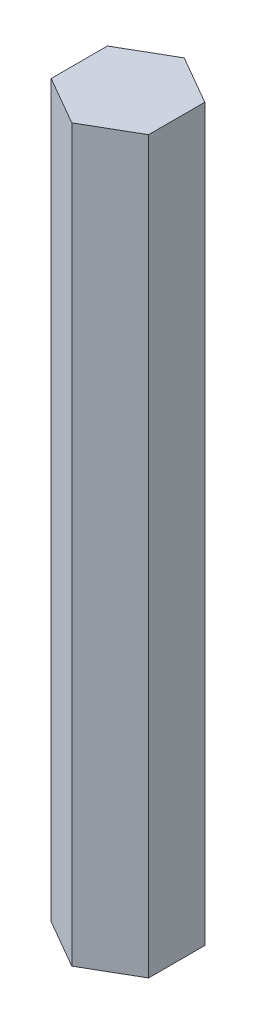
ISO-10303-21;
HEADER;
FILE_DESCRIPTION(('STEP AP214'),'2;1');
FILE_NAME('part.step','',(''),(''),'','','');
FILE_SCHEMA(('AUTOMOTIVE_DESIGN { 1 0 10303 214 1 1 1 1 }'));
ENDSEC;
DATA;
#1=APPLICATION_CONTEXT('core data for automotive mechanical design processes');
#2=APPLICATION_PROTOCOL_DEFINITION('international standard','automotive_design',2000,#1);
#3=PRODUCT_CONTEXT('',#1,'mechanical');
#4=PRODUCT('Part','Part','',(#3));
#5=PRODUCT_RELATED_PRODUCT_CATEGORY('part','',(#4));
#6=PRODUCT_DEFINITION_FORMATION('','',#4);
#7=PRODUCT_DEFINITION_CONTEXT('part definition',#1,'design');
#8=PRODUCT_DEFINITION('design','',#6,#7);
#9=PRODUCT_DEFINITION_SHAPE('','',#8);
#10=(LENGTH_UNIT() NAMED_UNIT(*) SI_UNIT(.MILLI.,.METRE.));
#11=(NAMED_UNIT(*) PLANE_ANGLE_UNIT() SI_UNIT($,.RADIAN.));
#12=(NAMED_UNIT(*) SI_UNIT($,.STERADIAN.) SOLID_ANGLE_UNIT());
#13=UNCERTAINTY_MEASURE_WITH_UNIT(LENGTH_MEASURE(1.E-05),#10,'distance_accuracy_value','');
#14=(GEOMETRIC_REPRESENTATION_CONTEXT(3) GLOBAL_UNCERTAINTY_ASSIGNED_CONTEXT((#13)) GLOBAL_UNIT_ASSIGNED_CONTEXT((#10,
#11,#12)) REPRESENTATION_CONTEXT('',''));
#15=CARTESIAN_POINT('',(0.,0.,0.));
#16=DIRECTION('',(0.,0.,1.));
#17=DIRECTION('',(1.,0.,0.));
#18=AXIS2_PLACEMENT_3D('',#15,#16,#17);
#19=CARTESIAN_POINT('',(-3.00000000000003,45.,1.73205080756889));
#20=DIRECTION('',(0.500000000000001,0.,-0.866025403784438));
#21=DIRECTION('',(-0.866025403784438,0.,-0.500000000000001));
#22=AXIS2_PLACEMENT_3D('',#19,#20,#21);
#23=PLANE('',#22);
#24=DIRECTION('',(0.866025403784438,0.,0.500000000000001));
#25=VECTOR('',#24,1.);
#26=CARTESIAN_POINT('',(-3.00000000000003,0.,1.73205080756889));
#27=LINE('',#26,#25);
#28=CARTESIAN_POINT('',(-3.00000000000003,0.,1.73205080756889));
#29=VERTEX_POINT('',#28);
#30=CARTESIAN_POINT('',(0.,0.,3.46410161513779));
#31=VERTEX_POINT('',#30);
#32=EDGE_CURVE('E132',#29,#31,#27,.T.);
#33=ORIENTED_EDGE('',*,*,#32,.T.);
#34=DIRECTION('',(0.,-1.,0.));
#35=VECTOR('',#34,1.);
#36=CARTESIAN_POINT('',(0.,45.,3.46410161513779));
#37=LINE('',#36,#35);
#38=CARTESIAN_POINT('',(0.,45.,3.46410161513779));
#39=VERTEX_POINT('',#38);
#40=EDGE_CURVE('E11',#39,#31,#37,.T.);
#41=ORIENTED_EDGE('',*,*,#40,.F.);
#42=DIRECTION('',(0.866025403784438,0.,0.500000000000001));
#43=VECTOR('',#42,1.);
#44=CARTESIAN_POINT('',(-3.00000000000003,45.,1.73205080756889));
#45=LINE('',#44,#43);
#46=CARTESIAN_POINT('',(-3.00000000000003,45.,1.73205080756889));
#47=VERTEX_POINT('',#46);
#48=EDGE_CURVE('E148',#47,#39,#45,.T.);
#49=ORIENTED_EDGE('',*,*,#48,.F.);
#50=DIRECTION('',(0.,-1.,0.));
#51=VECTOR('',#50,1.);
#52=CARTESIAN_POINT('',(-3.00000000000003,45.,1.73205080756889));
#53=LINE('',#52,#51);
#54=EDGE_CURVE('E128',#47,#29,#53,.T.);
#55=ORIENTED_EDGE('',*,*,#54,.T.);
#56=EDGE_LOOP('',(#33,#41,#49,#55));
#57=FACE_BOUND('',#56,.T.);
#58=ADVANCED_FACE('F43',(#57),#23,.F.);
#59=CARTESIAN_POINT('',(0.,45.,3.46410161513779));
#60=DIRECTION('',(-0.5,0.,-0.866025403784438));
#61=DIRECTION('',(-0.866025403784439,0.,0.5));
#62=AXIS2_PLACEMENT_3D('',#59,#60,#61);
#63=PLANE('',#62);
#64=DIRECTION('',(0.866025403784438,0.,-0.5));
#65=VECTOR('',#64,1.);
#66=CARTESIAN_POINT('',(0.,0.,3.46410161513779));
#67=LINE('',#66,#65);
#68=CARTESIAN_POINT('',(3.00000000000002,0.,1.73205080756889));
#69=VERTEX_POINT('',#68);
#70=EDGE_CURVE('E136',#31,#69,#67,.T.);
#71=ORIENTED_EDGE('',*,*,#70,.T.);
#72=DIRECTION('',(0.,-1.,0.));
#73=VECTOR('',#72,1.);
#74=CARTESIAN_POINT('',(3.00000000000002,45.,1.73205080756889));
#75=LINE('',#74,#73);
#76=CARTESIAN_POINT('',(3.00000000000002,45.,1.73205080756889));
#77=VERTEX_POINT('',#76);
#78=EDGE_CURVE('E52',#77,#69,#75,.T.);
#79=ORIENTED_EDGE('',*,*,#78,.F.);
#80=DIRECTION('',(0.866025403784438,0.,-0.5));
#81=VECTOR('',#80,1.);
#82=CARTESIAN_POINT('',(0.,45.,3.46410161513779));
#83=LINE('',#82,#81);
#84=EDGE_CURVE('E97',#39,#77,#83,.T.);
#85=ORIENTED_EDGE('',*,*,#84,.F.);
#86=ORIENTED_EDGE('',*,*,#40,.T.);
#87=EDGE_LOOP('',(#71,#79,#85,#86));
#88=FACE_BOUND('',#87,.T.);
#89=ADVANCED_FACE('F176',(#88),#63,.F.);
#90=CARTESIAN_POINT('',(3.00000000000002,45.,1.73205080756889));
#91=DIRECTION('',(-1.,0.,0.));
#92=DIRECTION('',(0.,0.,1.));
#93=AXIS2_PLACEMENT_3D('',#90,#91,#92);
#94=PLANE('',#93);
#95=DIRECTION('',(0.,0.,-1.));
#96=VECTOR('',#95,1.);
#97=CARTESIAN_POINT('',(3.00000000000002,0.,1.73205080756889));
#98=LINE('',#97,#96);
#99=CARTESIAN_POINT('',(3.00000000000002,0.,-1.7320508075689));
#100=VERTEX_POINT('',#99);
#101=EDGE_CURVE('E139',#69,#100,#98,.T.);
#102=ORIENTED_EDGE('',*,*,#101,.T.);
#103=DIRECTION('',(0.,-1.,0.));
#104=VECTOR('',#103,1.);
#105=CARTESIAN_POINT('',(3.00000000000002,45.,-1.7320508075689));
#106=LINE('',#105,#104);
#107=CARTESIAN_POINT('',(3.00000000000002,45.,-1.7320508075689));
#108=VERTEX_POINT('',#107);
#109=EDGE_CURVE('E121',#108,#100,#106,.T.);
#110=ORIENTED_EDGE('',*,*,#109,.F.);
#111=DIRECTION('',(0.,0.,-1.));
#112=VECTOR('',#111,1.);
#113=CARTESIAN_POINT('',(3.00000000000002,45.,1.73205080756889));
#114=LINE('',#113,#112);
#115=EDGE_CURVE('E110',#77,#108,#114,.T.);
#116=ORIENTED_EDGE('',*,*,#115,.F.);
#117=ORIENTED_EDGE('',*,*,#78,.T.);
#118=EDGE_LOOP('',(#102,#110,#116,#117));
#119=FACE_BOUND('',#118,.T.);
#120=ADVANCED_FACE('F158',(#119),#94,.F.);
#121=CARTESIAN_POINT('',(3.00000000000002,45.,-1.7320508075689));
#122=DIRECTION('',(-0.5,0.,0.866025403784439));
#123=DIRECTION('',(0.866025403784439,0.,0.5));
#124=AXIS2_PLACEMENT_3D('',#121,#122,#123);
#125=PLANE('',#124);
#126=DIRECTION('',(-0.866025403784439,0.,-0.5));
#127=VECTOR('',#126,1.);
#128=CARTESIAN_POINT('',(3.00000000000002,0.,-1.7320508075689));
#129=LINE('',#128,#127);
#130=CARTESIAN_POINT('',(0.,0.,-3.46410161513779));
#131=VERTEX_POINT('',#130);
#132=EDGE_CURVE('E119',#100,#131,#129,.T.);
#133=ORIENTED_EDGE('',*,*,#132,.T.);
#134=DIRECTION('',(0.,-1.,0.));
#135=VECTOR('',#134,1.);
#136=CARTESIAN_POINT('',(0.,45.,-3.46410161513779));
#137=LINE('',#136,#135);
#138=CARTESIAN_POINT('',(0.,45.,-3.46410161513779));
#139=VERTEX_POINT('',#138);
#140=EDGE_CURVE('E116',#139,#131,#137,.T.);
#141=ORIENTED_EDGE('',*,*,#140,.F.);
#142=DIRECTION('',(-0.866025403784439,0.,-0.5));
#143=VECTOR('',#142,1.);
#144=CARTESIAN_POINT('',(3.00000000000002,45.,-1.7320508075689));
#145=LINE('',#144,#143);
#146=EDGE_CURVE('E104',#108,#139,#145,.T.);
#147=ORIENTED_EDGE('',*,*,#146,.F.);
#148=ORIENTED_EDGE('',*,*,#109,.T.);
#149=EDGE_LOOP('',(#133,#141,#147,#148));
#150=FACE_BOUND('',#149,.T.);
#151=ADVANCED_FACE('F117',(#150),#125,.F.);
#152=CARTESIAN_POINT('',(0.,45.,-3.46410161513779));
#153=DIRECTION('',(0.5,0.,0.866025403784439));
#154=DIRECTION('',(0.866025403784439,0.,-0.5));
#155=AXIS2_PLACEMENT_3D('',#152,#153,#154);
#156=PLANE('',#155);
#157=DIRECTION('',(-0.866025403784439,0.,0.5));
#158=VECTOR('',#157,1.);
#159=CARTESIAN_POINT('',(0.,0.,-3.46410161513779));
#160=LINE('',#159,#158);
#161=CARTESIAN_POINT('',(-3.00000000000003,0.,-1.73205080756889));
#162=VERTEX_POINT('',#161);
#163=EDGE_CURVE('E83',#131,#162,#160,.T.);
#164=ORIENTED_EDGE('',*,*,#163,.T.);
#165=DIRECTION('',(0.,-1.,0.));
#166=VECTOR('',#165,1.);
#167=CARTESIAN_POINT('',(-3.00000000000003,45.,-1.73205080756889));
#168=LINE('',#167,#166);
#169=CARTESIAN_POINT('',(-3.00000000000003,45.,-1.73205080756889));
#170=VERTEX_POINT('',#169);
#171=EDGE_CURVE('E122',#170,#162,#168,.T.);
#172=ORIENTED_EDGE('',*,*,#171,.F.);
#173=DIRECTION('',(-0.866025403784439,0.,0.5));
#174=VECTOR('',#173,1.);
#175=CARTESIAN_POINT('',(0.,45.,-3.46410161513779));
#176=LINE('',#175,#174);
#177=EDGE_CURVE('E108',#139,#170,#176,.T.);
#178=ORIENTED_EDGE('',*,*,#177,.F.);
#179=ORIENTED_EDGE('',*,*,#140,.T.);
#180=EDGE_LOOP('',(#164,#172,#178,#179));
#181=FACE_BOUND('',#180,.T.);
#182=ADVANCED_FACE('F124',(#181),#156,.F.);
#183=CARTESIAN_POINT('',(-3.00000000000003,45.,-1.73205080756889));
#184=DIRECTION('',(1.,0.,0.));
#185=DIRECTION('',(0.,0.,-1.));
#186=AXIS2_PLACEMENT_3D('',#183,#184,#185);
#187=PLANE('',#186);
#188=DIRECTION('',(0.,0.,1.));
#189=VECTOR('',#188,1.);
#190=CARTESIAN_POINT('',(-3.00000000000003,0.,-1.73205080756889));
#191=LINE('',#190,#189);
#192=EDGE_CURVE('E89',#162,#29,#191,.T.);
#193=ORIENTED_EDGE('',*,*,#192,.T.);
#194=ORIENTED_EDGE('',*,*,#54,.F.);
#195=DIRECTION('',(0.,0.,1.));
#196=VECTOR('',#195,1.);
#197=CARTESIAN_POINT('',(-3.00000000000003,45.,-1.73205080756889));
#198=LINE('',#197,#196);
#199=EDGE_CURVE('E60',#170,#47,#198,.T.);
#200=ORIENTED_EDGE('',*,*,#199,.F.);
#201=ORIENTED_EDGE('',*,*,#171,.T.);
#202=EDGE_LOOP('',(#193,#194,#200,#201));
#203=FACE_BOUND('',#202,.T.);
#204=ADVANCED_FACE('F165',(#203),#187,.F.);
#205=CARTESIAN_POINT('',(0.,45.,0.));
#206=DIRECTION('',(0.,1.,0.));
#207=DIRECTION('',(0.,0.,1.));
#208=AXIS2_PLACEMENT_3D('',#205,#206,#207);
#209=PLANE('',#208);
#210=ORIENTED_EDGE('',*,*,#48,.T.);
#211=ORIENTED_EDGE('',*,*,#84,.T.);
#212=ORIENTED_EDGE('',*,*,#115,.T.);
#213=ORIENTED_EDGE('',*,*,#146,.T.);
#214=ORIENTED_EDGE('',*,*,#177,.T.);
#215=ORIENTED_EDGE('',*,*,#199,.T.);
#216=EDGE_LOOP('',(#210,#211,#212,#213,#214,#215));
#217=FACE_BOUND('',#216,.T.);
#218=ADVANCED_FACE('F106',(#217),#209,.T.);
#219=CARTESIAN_POINT('',(0.,0.,0.));
#220=DIRECTION('',(0.,1.,0.));
#221=DIRECTION('',(0.,0.,1.));
#222=AXIS2_PLACEMENT_3D('',#219,#220,#221);
#223=PLANE('',#222);
#224=ORIENTED_EDGE('',*,*,#32,.F.);
#225=ORIENTED_EDGE('',*,*,#192,.F.);
#226=ORIENTED_EDGE('',*,*,#163,.F.);
#227=ORIENTED_EDGE('',*,*,#132,.F.);
#228=ORIENTED_EDGE('',*,*,#101,.F.);
#229=ORIENTED_EDGE('',*,*,#70,.F.);
#230=EDGE_LOOP('',(#224,#225,#226,#227,#228,#229));
#231=FACE_BOUND('',#230,.T.);
#232=ADVANCED_FACE('F161',(#231),#223,.F.);
#233=CLOSED_SHELL('',(#58,#89,#120,#151,#182,#204,#218,#232));
#234=MANIFOLD_SOLID_BREP('B2',#233);
#235=ADVANCED_BREP_SHAPE_REPRESENTATION('',(#18,#234),#14);
#236=SHAPE_DEFINITION_REPRESENTATION(#9,#235);
ENDSEC;
END-ISO-10303-21;
